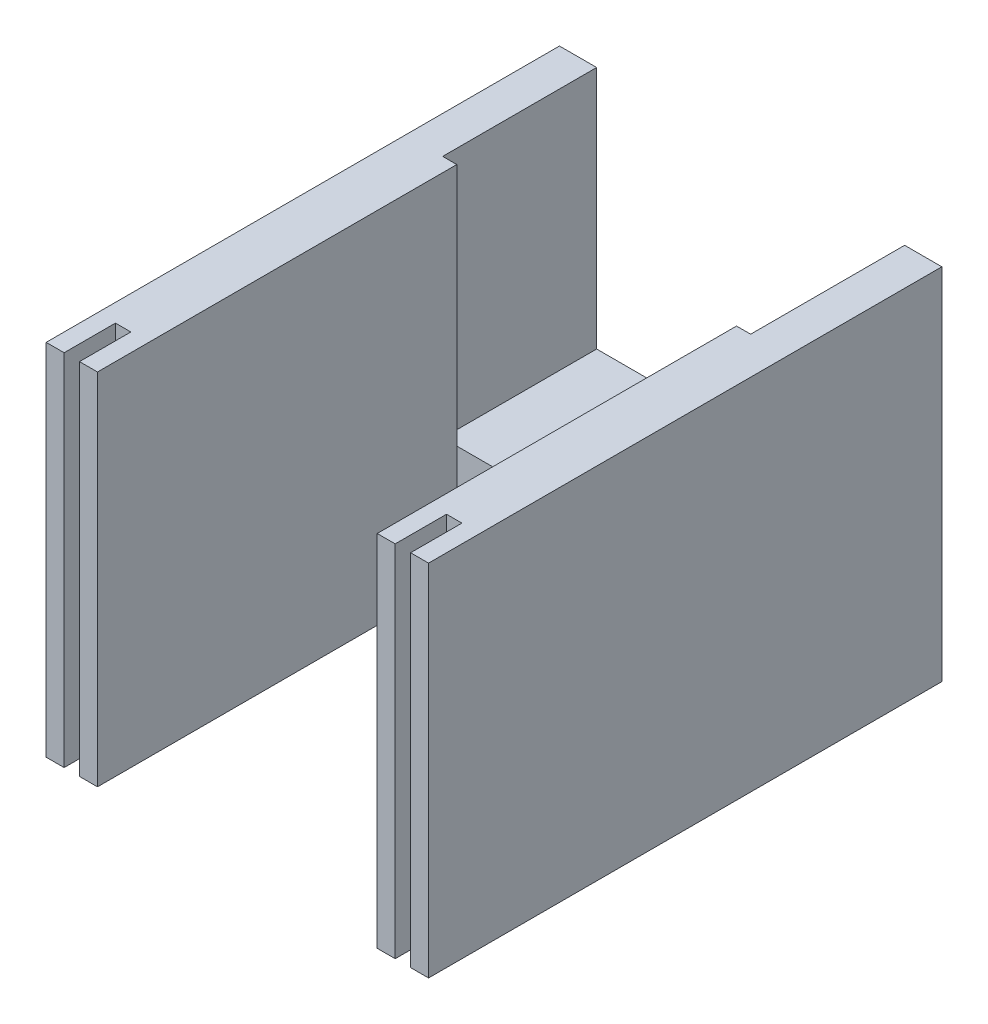
ISO-10303-21;
HEADER;
FILE_DESCRIPTION(('STEP AP214'),'2;1');
FILE_NAME('part.step','',(''),(''),'','','');
FILE_SCHEMA(('AUTOMOTIVE_DESIGN { 1 0 10303 214 1 1 1 1 }'));
ENDSEC;
DATA;
#1=APPLICATION_CONTEXT('core data for automotive mechanical design processes');
#2=APPLICATION_PROTOCOL_DEFINITION('international standard','automotive_design',2000,#1);
#3=PRODUCT_CONTEXT('',#1,'mechanical');
#4=PRODUCT('Part','Part','',(#3));
#5=PRODUCT_RELATED_PRODUCT_CATEGORY('part','',(#4));
#6=PRODUCT_DEFINITION_FORMATION('','',#4);
#7=PRODUCT_DEFINITION_CONTEXT('part definition',#1,'design');
#8=PRODUCT_DEFINITION('design','',#6,#7);
#9=PRODUCT_DEFINITION_SHAPE('','',#8);
#10=(LENGTH_UNIT() NAMED_UNIT(*) SI_UNIT(.MILLI.,.METRE.));
#11=(NAMED_UNIT(*) PLANE_ANGLE_UNIT() SI_UNIT($,.RADIAN.));
#12=(NAMED_UNIT(*) SI_UNIT($,.STERADIAN.) SOLID_ANGLE_UNIT());
#13=UNCERTAINTY_MEASURE_WITH_UNIT(LENGTH_MEASURE(1.E-05),#10,'distance_accuracy_value','');
#14=(GEOMETRIC_REPRESENTATION_CONTEXT(3) GLOBAL_UNCERTAINTY_ASSIGNED_CONTEXT((#13)) GLOBAL_UNIT_ASSIGNED_CONTEXT((#10,
#11,#12)) REPRESENTATION_CONTEXT('',''));
#15=CARTESIAN_POINT('',(0.,0.,0.));
#16=DIRECTION('',(0.,0.,1.));
#17=DIRECTION('',(1.,0.,0.));
#18=AXIS2_PLACEMENT_3D('',#15,#16,#17);
#19=CARTESIAN_POINT('',(0.,0.,0.));
#20=DIRECTION('',(0.,1.,0.));
#21=DIRECTION('',(0.,0.,1.));
#22=AXIS2_PLACEMENT_3D('',#19,#20,#21);
#23=PLANE('',#22);
#24=DIRECTION('',(0.,0.,-1.));
#25=VECTOR('',#24,1.);
#26=CARTESIAN_POINT('',(61.3659700427576,0.,0.));
#27=LINE('',#26,#25);
#28=CARTESIAN_POINT('',(61.3659700427576,0.,-70.));
#29=VERTEX_POINT('',#28);
#30=CARTESIAN_POINT('',(61.3659700427576,0.,-100.));
#31=VERTEX_POINT('',#30);
#32=EDGE_CURVE('E233',#29,#31,#27,.T.);
#33=ORIENTED_EDGE('',*,*,#32,.T.);
#34=DIRECTION('',(1.,0.,0.));
#35=VECTOR('',#34,1.);
#36=CARTESIAN_POINT('',(0.,0.,-100.));
#37=LINE('',#36,#35);
#38=CARTESIAN_POINT('',(74.5,0.,-100.));
#39=VERTEX_POINT('',#38);
#40=EDGE_CURVE('E227',#31,#39,#37,.T.);
#41=ORIENTED_EDGE('',*,*,#40,.T.);
#42=DIRECTION('',(0.,0.,-1.));
#43=VECTOR('',#42,1.);
#44=CARTESIAN_POINT('',(74.5,0.,0.));
#45=LINE('',#44,#43);
#46=CARTESIAN_POINT('',(74.5,0.,0.));
#47=VERTEX_POINT('',#46);
#48=EDGE_CURVE('E417',#47,#39,#45,.T.);
#49=ORIENTED_EDGE('',*,*,#48,.F.);
#50=DIRECTION('',(1.,0.,0.));
#51=VECTOR('',#50,1.);
#52=CARTESIAN_POINT('',(0.,0.,0.));
#53=LINE('',#52,#51);
#54=CARTESIAN_POINT('',(71.,0.,0.));
#55=VERTEX_POINT('',#54);
#56=EDGE_CURVE('E381',#55,#47,#53,.T.);
#57=ORIENTED_EDGE('',*,*,#56,.F.);
#58=DIRECTION('',(0.,0.,-1.));
#59=VECTOR('',#58,1.);
#60=CARTESIAN_POINT('',(71.,0.,0.));
#61=LINE('',#60,#59);
#62=CARTESIAN_POINT('',(71.,0.,-10.));
#63=VERTEX_POINT('',#62);
#64=EDGE_CURVE('E278',#55,#63,#61,.T.);
#65=ORIENTED_EDGE('',*,*,#64,.T.);
#66=DIRECTION('',(-1.,0.,0.));
#67=VECTOR('',#66,1.);
#68=CARTESIAN_POINT('',(0.,0.,-10.));
#69=LINE('',#68,#67);
#70=CARTESIAN_POINT('',(68.,0.,-10.));
#71=VERTEX_POINT('',#70);
#72=EDGE_CURVE('E283',#63,#71,#69,.T.);
#73=ORIENTED_EDGE('',*,*,#72,.T.);
#74=DIRECTION('',(0.,0.,-1.));
#75=VECTOR('',#74,1.);
#76=CARTESIAN_POINT('',(68.,0.,0.));
#77=LINE('',#76,#75);
#78=CARTESIAN_POINT('',(68.,0.,0.));
#79=VERTEX_POINT('',#78);
#80=EDGE_CURVE('E275',#79,#71,#77,.T.);
#81=ORIENTED_EDGE('',*,*,#80,.F.);
#82=CARTESIAN_POINT('',(64.5,0.,0.));
#83=VERTEX_POINT('',#82);
#84=EDGE_CURVE('E419',#83,#79,#53,.T.);
#85=ORIENTED_EDGE('',*,*,#84,.F.);
#86=DIRECTION('',(0.,0.,-1.));
#87=VECTOR('',#86,1.);
#88=CARTESIAN_POINT('',(64.5,0.,0.));
#89=LINE('',#88,#87);
#90=CARTESIAN_POINT('',(64.5,0.,-70.));
#91=VERTEX_POINT('',#90);
#92=EDGE_CURVE('E357',#83,#91,#89,.T.);
#93=ORIENTED_EDGE('',*,*,#92,.T.);
#94=DIRECTION('',(1.,0.,0.));
#95=VECTOR('',#94,1.);
#96=CARTESIAN_POINT('',(0.,0.,-70.));
#97=LINE('',#96,#95);
#98=EDGE_CURVE('E361',#29,#91,#97,.T.);
#99=ORIENTED_EDGE('',*,*,#98,.F.);
#100=EDGE_LOOP('',(#33,#41,#49,#57,#65,#73,#81,#85,#93,#99));
#101=FACE_BOUND('',#100,.T.);
#102=ADVANCED_FACE('F38',(#101),#23,.F.);
#103=CARTESIAN_POINT('',(0.,70.,-100.));
#104=DIRECTION('',(0.,0.,-1.));
#105=DIRECTION('',(-1.,0.,0.));
#106=AXIS2_PLACEMENT_3D('',#103,#104,#105);
#107=PLANE('',#106);
#108=ORIENTED_EDGE('',*,*,#40,.F.);
#109=DIRECTION('',(0.,1.,0.));
#110=VECTOR('',#109,1.);
#111=CARTESIAN_POINT('',(61.3659700427576,0.,-100.));
#112=LINE('',#111,#110);
#113=CARTESIAN_POINT('',(61.3659700427576,10.,-100.));
#114=VERTEX_POINT('',#113);
#115=EDGE_CURVE('E209',#31,#114,#112,.T.);
#116=ORIENTED_EDGE('',*,*,#115,.T.);
#117=DIRECTION('',(-1.,0.,0.));
#118=VECTOR('',#117,1.);
#119=CARTESIAN_POINT('',(61.3659700427576,10.,-100.));
#120=LINE('',#119,#118);
#121=CARTESIAN_POINT('',(10.6951974067737,10.,-100.));
#122=VERTEX_POINT('',#121);
#123=EDGE_CURVE('E217',#114,#122,#120,.T.);
#124=ORIENTED_EDGE('',*,*,#123,.T.);
#125=DIRECTION('',(0.,1.,0.));
#126=VECTOR('',#125,1.);
#127=CARTESIAN_POINT('',(10.6951974067737,0.,-100.));
#128=LINE('',#127,#126);
#129=CARTESIAN_POINT('',(10.6951974067737,0.,-100.));
#130=VERTEX_POINT('',#129);
#131=EDGE_CURVE('E222',#130,#122,#128,.T.);
#132=ORIENTED_EDGE('',*,*,#131,.F.);
#133=CARTESIAN_POINT('',(0.,0.,-100.));
#134=VERTEX_POINT('',#133);
#135=EDGE_CURVE('E423',#134,#130,#37,.T.);
#136=ORIENTED_EDGE('',*,*,#135,.F.);
#137=DIRECTION('',(0.,-1.,0.));
#138=VECTOR('',#137,1.);
#139=CARTESIAN_POINT('',(0.,70.,-100.));
#140=LINE('',#139,#138);
#141=CARTESIAN_POINT('',(0.,70.,-100.));
#142=VERTEX_POINT('',#141);
#143=EDGE_CURVE('E434',#142,#134,#140,.T.);
#144=ORIENTED_EDGE('',*,*,#143,.F.);
#145=DIRECTION('',(1.,0.,0.));
#146=VECTOR('',#145,1.);
#147=CARTESIAN_POINT('',(0.,70.,-100.));
#148=LINE('',#147,#146);
#149=CARTESIAN_POINT('',(7.25,70.,-100.));
#150=VERTEX_POINT('',#149);
#151=EDGE_CURVE('E404',#142,#150,#148,.T.);
#152=ORIENTED_EDGE('',*,*,#151,.T.);
#153=DIRECTION('',(0.,1.,0.));
#154=VECTOR('',#153,1.);
#155=CARTESIAN_POINT('',(7.25,22.5,-100.));
#156=LINE('',#155,#154);
#157=CARTESIAN_POINT('',(7.25,22.5,-100.));
#158=VERTEX_POINT('',#157);
#159=EDGE_CURVE('E328',#158,#150,#156,.T.);
#160=ORIENTED_EDGE('',*,*,#159,.F.);
#161=DIRECTION('',(-1.,0.,0.));
#162=VECTOR('',#161,1.);
#163=CARTESIAN_POINT('',(0.,22.5,-100.));
#164=LINE('',#163,#162);
#165=CARTESIAN_POINT('',(67.25,22.5,-100.));
#166=VERTEX_POINT('',#165);
#167=EDGE_CURVE('E311',#166,#158,#164,.T.);
#168=ORIENTED_EDGE('',*,*,#167,.F.);
#169=DIRECTION('',(0.,1.,0.));
#170=VECTOR('',#169,1.);
#171=CARTESIAN_POINT('',(67.25,22.5,-100.));
#172=LINE('',#171,#170);
#173=CARTESIAN_POINT('',(67.25,70.,-100.));
#174=VERTEX_POINT('',#173);
#175=EDGE_CURVE('E340',#166,#174,#172,.T.);
#176=ORIENTED_EDGE('',*,*,#175,.T.);
#177=CARTESIAN_POINT('',(74.5,70.,-100.));
#178=VERTEX_POINT('',#177);
#179=EDGE_CURVE('E403',#174,#178,#148,.T.);
#180=ORIENTED_EDGE('',*,*,#179,.T.);
#181=DIRECTION('',(0.,-1.,0.));
#182=VECTOR('',#181,1.);
#183=CARTESIAN_POINT('',(74.5,70.,-100.));
#184=LINE('',#183,#182);
#185=EDGE_CURVE('E437',#178,#39,#184,.T.);
#186=ORIENTED_EDGE('',*,*,#185,.T.);
#187=EDGE_LOOP('',(#108,#116,#124,#132,#136,#144,#152,#160,#168,#176,#180,#186));
#188=FACE_BOUND('',#187,.T.);
#189=ADVANCED_FACE('F225',(#188),#107,.T.);
#190=CARTESIAN_POINT('',(0.,0.,-70.));
#191=DIRECTION('',(0.,0.,1.));
#192=DIRECTION('',(1.,0.,0.));
#193=AXIS2_PLACEMENT_3D('',#190,#191,#192);
#194=PLANE('',#193);
#195=DIRECTION('',(1.,0.,0.));
#196=VECTOR('',#195,1.);
#197=CARTESIAN_POINT('',(0.,10.,-70.));
#198=LINE('',#197,#196);
#199=CARTESIAN_POINT('',(10.6951974067737,10.,-70.));
#200=VERTEX_POINT('',#199);
#201=CARTESIAN_POINT('',(61.3659700427576,10.,-70.));
#202=VERTEX_POINT('',#201);
#203=EDGE_CURVE('E47',#200,#202,#198,.T.);
#204=ORIENTED_EDGE('',*,*,#203,.T.);
#205=DIRECTION('',(0.,-1.,0.));
#206=VECTOR('',#205,1.);
#207=CARTESIAN_POINT('',(61.3659700427576,0.,-70.));
#208=LINE('',#207,#206);
#209=EDGE_CURVE('E11',#202,#29,#208,.T.);
#210=ORIENTED_EDGE('',*,*,#209,.T.);
#211=ORIENTED_EDGE('',*,*,#98,.T.);
#212=DIRECTION('',(0.,1.,0.));
#213=VECTOR('',#212,1.);
#214=CARTESIAN_POINT('',(64.5,0.,-70.));
#215=LINE('',#214,#213);
#216=CARTESIAN_POINT('',(64.5,22.5,-70.));
#217=VERTEX_POINT('',#216);
#218=EDGE_CURVE('E386',#91,#217,#215,.T.);
#219=ORIENTED_EDGE('',*,*,#218,.T.);
#220=DIRECTION('',(-1.,0.,0.));
#221=VECTOR('',#220,1.);
#222=CARTESIAN_POINT('',(0.,22.5,-70.));
#223=LINE('',#222,#221);
#224=CARTESIAN_POINT('',(10.,22.5,-70.));
#225=VERTEX_POINT('',#224);
#226=EDGE_CURVE('E325',#217,#225,#223,.T.);
#227=ORIENTED_EDGE('',*,*,#226,.T.);
#228=DIRECTION('',(0.,1.,0.));
#229=VECTOR('',#228,1.);
#230=CARTESIAN_POINT('',(10.,0.,-70.));
#231=LINE('',#230,#229);
#232=CARTESIAN_POINT('',(10.,0.,-70.));
#233=VERTEX_POINT('',#232);
#234=EDGE_CURVE('E382',#233,#225,#231,.T.);
#235=ORIENTED_EDGE('',*,*,#234,.F.);
#236=CARTESIAN_POINT('',(10.6951974067737,0.,-70.));
#237=VERTEX_POINT('',#236);
#238=EDGE_CURVE('E363',#233,#237,#97,.T.);
#239=ORIENTED_EDGE('',*,*,#238,.T.);
#240=DIRECTION('',(0.,-1.,0.));
#241=VECTOR('',#240,1.);
#242=CARTESIAN_POINT('',(10.6951974067737,0.,-70.));
#243=LINE('',#242,#241);
#244=EDGE_CURVE('E444',#200,#237,#243,.T.);
#245=ORIENTED_EDGE('',*,*,#244,.F.);
#246=EDGE_LOOP('',(#204,#210,#211,#219,#227,#235,#239,#245));
#247=FACE_BOUND('',#246,.T.);
#248=ADVANCED_FACE('F449',(#247),#194,.T.);
#249=ORIENTED_EDGE('',*,*,#135,.T.);
#250=DIRECTION('',(0.,0.,-1.));
#251=VECTOR('',#250,1.);
#252=CARTESIAN_POINT('',(10.6951974067737,0.,0.));
#253=LINE('',#252,#251);
#254=EDGE_CURVE('E236',#237,#130,#253,.T.);
#255=ORIENTED_EDGE('',*,*,#254,.F.);
#256=ORIENTED_EDGE('',*,*,#238,.F.);
#257=DIRECTION('',(0.,0.,-1.));
#258=VECTOR('',#257,1.);
#259=CARTESIAN_POINT('',(10.,0.,0.));
#260=LINE('',#259,#258);
#261=CARTESIAN_POINT('',(10.,0.,0.));
#262=VERTEX_POINT('',#261);
#263=EDGE_CURVE('E367',#262,#233,#260,.T.);
#264=ORIENTED_EDGE('',*,*,#263,.F.);
#265=CARTESIAN_POINT('',(6.5,0.,0.));
#266=VERTEX_POINT('',#265);
#267=EDGE_CURVE('E418',#266,#262,#53,.T.);
#268=ORIENTED_EDGE('',*,*,#267,.F.);
#269=DIRECTION('',(0.,0.,-1.));
#270=VECTOR('',#269,1.);
#271=CARTESIAN_POINT('',(6.5,0.,0.));
#272=LINE('',#271,#270);
#273=CARTESIAN_POINT('',(6.5,0.,-10.));
#274=VERTEX_POINT('',#273);
#275=EDGE_CURVE('E62',#266,#274,#272,.T.);
#276=ORIENTED_EDGE('',*,*,#275,.T.);
#277=DIRECTION('',(-1.,0.,0.));
#278=VECTOR('',#277,1.);
#279=CARTESIAN_POINT('',(0.,0.,-10.));
#280=LINE('',#279,#278);
#281=CARTESIAN_POINT('',(3.5,0.,-10.));
#282=VERTEX_POINT('',#281);
#283=EDGE_CURVE('E247',#274,#282,#280,.T.);
#284=ORIENTED_EDGE('',*,*,#283,.T.);
#285=DIRECTION('',(0.,0.,-1.));
#286=VECTOR('',#285,1.);
#287=CARTESIAN_POINT('',(3.5,0.,0.));
#288=LINE('',#287,#286);
#289=CARTESIAN_POINT('',(3.5,0.,0.));
#290=VERTEX_POINT('',#289);
#291=EDGE_CURVE('E241',#290,#282,#288,.T.);
#292=ORIENTED_EDGE('',*,*,#291,.F.);
#293=CARTESIAN_POINT('',(0.,0.,0.));
#294=VERTEX_POINT('',#293);
#295=EDGE_CURVE('E413',#294,#290,#53,.T.);
#296=ORIENTED_EDGE('',*,*,#295,.F.);
#297=DIRECTION('',(0.,0.,-1.));
#298=VECTOR('',#297,1.);
#299=CARTESIAN_POINT('',(0.,0.,0.));
#300=LINE('',#299,#298);
#301=EDGE_CURVE('E427',#294,#134,#300,.T.);
#302=ORIENTED_EDGE('',*,*,#301,.T.);
#303=EDGE_LOOP('',(#249,#255,#256,#264,#268,#276,#284,#292,#296,#302));
#304=FACE_BOUND('',#303,.T.);
#305=ADVANCED_FACE('F456',(#304),#23,.F.);
#306=CARTESIAN_POINT('',(0.,70.,0.));
#307=DIRECTION('',(0.,1.,0.));
#308=DIRECTION('',(0.,0.,1.));
#309=AXIS2_PLACEMENT_3D('',#306,#307,#308);
#310=PLANE('',#309);
#311=DIRECTION('',(1.,0.,0.));
#312=VECTOR('',#311,1.);
#313=CARTESIAN_POINT('',(0.,70.,0.));
#314=LINE('',#313,#312);
#315=CARTESIAN_POINT('',(0.,70.,0.));
#316=VERTEX_POINT('',#315);
#317=CARTESIAN_POINT('',(3.5,70.,0.));
#318=VERTEX_POINT('',#317);
#319=EDGE_CURVE('E393',#316,#318,#314,.T.);
#320=ORIENTED_EDGE('',*,*,#319,.T.);
#321=DIRECTION('',(0.,0.,-1.));
#322=VECTOR('',#321,1.);
#323=CARTESIAN_POINT('',(3.5,70.,0.));
#324=LINE('',#323,#322);
#325=CARTESIAN_POINT('',(3.5,70.,-10.));
#326=VERTEX_POINT('',#325);
#327=EDGE_CURVE('E214',#318,#326,#324,.T.);
#328=ORIENTED_EDGE('',*,*,#327,.T.);
#329=DIRECTION('',(-1.,0.,0.));
#330=VECTOR('',#329,1.);
#331=CARTESIAN_POINT('',(0.,70.,-10.));
#332=LINE('',#331,#330);
#333=CARTESIAN_POINT('',(6.5,70.,-10.));
#334=VERTEX_POINT('',#333);
#335=EDGE_CURVE('E244',#334,#326,#332,.T.);
#336=ORIENTED_EDGE('',*,*,#335,.F.);
#337=DIRECTION('',(0.,0.,-1.));
#338=VECTOR('',#337,1.);
#339=CARTESIAN_POINT('',(6.5,70.,0.));
#340=LINE('',#339,#338);
#341=CARTESIAN_POINT('',(6.5,70.,0.));
#342=VERTEX_POINT('',#341);
#343=EDGE_CURVE('E255',#342,#334,#340,.T.);
#344=ORIENTED_EDGE('',*,*,#343,.F.);
#345=CARTESIAN_POINT('',(10.,70.,0.));
#346=VERTEX_POINT('',#345);
#347=EDGE_CURVE('E398',#342,#346,#314,.T.);
#348=ORIENTED_EDGE('',*,*,#347,.T.);
#349=DIRECTION('',(0.,0.,-1.));
#350=VECTOR('',#349,1.);
#351=CARTESIAN_POINT('',(10.,70.,0.));
#352=LINE('',#351,#350);
#353=CARTESIAN_POINT('',(10.,70.,-70.));
#354=VERTEX_POINT('',#353);
#355=EDGE_CURVE('E362',#346,#354,#352,.T.);
#356=ORIENTED_EDGE('',*,*,#355,.T.);
#357=DIRECTION('',(-1.,0.,0.));
#358=VECTOR('',#357,1.);
#359=CARTESIAN_POINT('',(0.,70.,-70.));
#360=LINE('',#359,#358);
#361=CARTESIAN_POINT('',(7.25,70.,-70.));
#362=VERTEX_POINT('',#361);
#363=EDGE_CURVE('E332',#354,#362,#360,.T.);
#364=ORIENTED_EDGE('',*,*,#363,.T.);
#365=DIRECTION('',(0.,0.,1.));
#366=VECTOR('',#365,1.);
#367=CARTESIAN_POINT('',(7.25,70.,0.));
#368=LINE('',#367,#366);
#369=EDGE_CURVE('E301',#150,#362,#368,.T.);
#370=ORIENTED_EDGE('',*,*,#369,.F.);
#371=ORIENTED_EDGE('',*,*,#151,.F.);
#372=DIRECTION('',(0.,0.,-1.));
#373=VECTOR('',#372,1.);
#374=CARTESIAN_POINT('',(0.,70.,0.));
#375=LINE('',#374,#373);
#376=EDGE_CURVE('E408',#316,#142,#375,.T.);
#377=ORIENTED_EDGE('',*,*,#376,.F.);
#378=EDGE_LOOP('',(#320,#328,#336,#344,#348,#356,#364,#370,#371,#377));
#379=FACE_BOUND('',#378,.T.);
#380=ADVANCED_FACE('F467',(#379),#310,.T.);
#381=CARTESIAN_POINT('',(0.,70.,0.));
#382=DIRECTION('',(0.,0.,-1.));
#383=DIRECTION('',(-1.,0.,0.));
#384=AXIS2_PLACEMENT_3D('',#381,#382,#383);
#385=PLANE('',#384);
#386=DIRECTION('',(0.,1.,0.));
#387=VECTOR('',#386,1.);
#388=CARTESIAN_POINT('',(3.5,0.,0.));
#389=LINE('',#388,#387);
#390=EDGE_CURVE('E251',#290,#318,#389,.T.);
#391=ORIENTED_EDGE('',*,*,#390,.T.);
#392=ORIENTED_EDGE('',*,*,#319,.F.);
#393=DIRECTION('',(0.,-1.,0.));
#394=VECTOR('',#393,1.);
#395=CARTESIAN_POINT('',(0.,70.,0.));
#396=LINE('',#395,#394);
#397=EDGE_CURVE('E412',#316,#294,#396,.T.);
#398=ORIENTED_EDGE('',*,*,#397,.T.);
#399=ORIENTED_EDGE('',*,*,#295,.T.);
#400=EDGE_LOOP('',(#391,#392,#398,#399));
#401=FACE_BOUND('',#400,.T.);
#402=ADVANCED_FACE('F472',(#401),#385,.F.);
#403=CARTESIAN_POINT('',(64.5,70.,0.));
#404=VERTEX_POINT('',#403);
#405=CARTESIAN_POINT('',(68.,70.,0.));
#406=VERTEX_POINT('',#405);
#407=EDGE_CURVE('E399',#404,#406,#314,.T.);
#408=ORIENTED_EDGE('',*,*,#407,.T.);
#409=DIRECTION('',(0.,0.,-1.));
#410=VECTOR('',#409,1.);
#411=CARTESIAN_POINT('',(68.,70.,0.));
#412=LINE('',#411,#410);
#413=CARTESIAN_POINT('',(68.,70.,-10.));
#414=VERTEX_POINT('',#413);
#415=EDGE_CURVE('E265',#406,#414,#412,.T.);
#416=ORIENTED_EDGE('',*,*,#415,.T.);
#417=DIRECTION('',(-1.,0.,0.));
#418=VECTOR('',#417,1.);
#419=CARTESIAN_POINT('',(0.,70.,-10.));
#420=LINE('',#419,#418);
#421=CARTESIAN_POINT('',(71.,70.,-10.));
#422=VERTEX_POINT('',#421);
#423=EDGE_CURVE('E279',#422,#414,#420,.T.);
#424=ORIENTED_EDGE('',*,*,#423,.F.);
#425=DIRECTION('',(0.,0.,-1.));
#426=VECTOR('',#425,1.);
#427=CARTESIAN_POINT('',(71.,70.,0.));
#428=LINE('',#427,#426);
#429=CARTESIAN_POINT('',(71.,70.,0.));
#430=VERTEX_POINT('',#429);
#431=EDGE_CURVE('E291',#430,#422,#428,.T.);
#432=ORIENTED_EDGE('',*,*,#431,.F.);
#433=CARTESIAN_POINT('',(74.5,70.,0.));
#434=VERTEX_POINT('',#433);
#435=EDGE_CURVE('E431',#430,#434,#314,.T.);
#436=ORIENTED_EDGE('',*,*,#435,.T.);
#437=DIRECTION('',(0.,0.,-1.));
#438=VECTOR('',#437,1.);
#439=CARTESIAN_POINT('',(74.5,70.,0.));
#440=LINE('',#439,#438);
#441=EDGE_CURVE('E397',#434,#178,#440,.T.);
#442=ORIENTED_EDGE('',*,*,#441,.T.);
#443=ORIENTED_EDGE('',*,*,#179,.F.);
#444=DIRECTION('',(0.,0.,1.));
#445=VECTOR('',#444,1.);
#446=CARTESIAN_POINT('',(67.25,70.,0.));
#447=LINE('',#446,#445);
#448=CARTESIAN_POINT('',(67.25,70.,-70.));
#449=VERTEX_POINT('',#448);
#450=EDGE_CURVE('E316',#174,#449,#447,.T.);
#451=ORIENTED_EDGE('',*,*,#450,.T.);
#452=CARTESIAN_POINT('',(64.5,70.,-70.));
#453=VERTEX_POINT('',#452);
#454=EDGE_CURVE('E333',#449,#453,#360,.T.);
#455=ORIENTED_EDGE('',*,*,#454,.T.);
#456=DIRECTION('',(0.,0.,-1.));
#457=VECTOR('',#456,1.);
#458=CARTESIAN_POINT('',(64.5,70.,0.));
#459=LINE('',#458,#457);
#460=EDGE_CURVE('E356',#404,#453,#459,.T.);
#461=ORIENTED_EDGE('',*,*,#460,.F.);
#462=EDGE_LOOP('',(#408,#416,#424,#432,#436,#442,#443,#451,#455,#461));
#463=FACE_BOUND('',#462,.T.);
#464=ADVANCED_FACE('F497',(#463),#310,.T.);
#465=DIRECTION('',(0.,1.,0.));
#466=VECTOR('',#465,1.);
#467=CARTESIAN_POINT('',(68.,0.,0.));
#468=LINE('',#467,#466);
#469=EDGE_CURVE('E287',#79,#406,#468,.T.);
#470=ORIENTED_EDGE('',*,*,#469,.T.);
#471=ORIENTED_EDGE('',*,*,#407,.F.);
#472=DIRECTION('',(0.,1.,0.));
#473=VECTOR('',#472,1.);
#474=CARTESIAN_POINT('',(64.5,0.,0.));
#475=LINE('',#474,#473);
#476=EDGE_CURVE('E370',#83,#404,#475,.T.);
#477=ORIENTED_EDGE('',*,*,#476,.F.);
#478=ORIENTED_EDGE('',*,*,#84,.T.);
#479=EDGE_LOOP('',(#470,#471,#477,#478));
#480=FACE_BOUND('',#479,.T.);
#481=ADVANCED_FACE('F574',(#480),#385,.F.);
#482=ORIENTED_EDGE('',*,*,#347,.F.);
#483=DIRECTION('',(0.,1.,0.));
#484=VECTOR('',#483,1.);
#485=CARTESIAN_POINT('',(6.5,0.,0.));
#486=LINE('',#485,#484);
#487=EDGE_CURVE('E269',#266,#342,#486,.T.);
#488=ORIENTED_EDGE('',*,*,#487,.F.);
#489=ORIENTED_EDGE('',*,*,#267,.T.);
#490=DIRECTION('',(0.,1.,0.));
#491=VECTOR('',#490,1.);
#492=CARTESIAN_POINT('',(10.,0.,0.));
#493=LINE('',#492,#491);
#494=EDGE_CURVE('E377',#262,#346,#493,.T.);
#495=ORIENTED_EDGE('',*,*,#494,.T.);
#496=EDGE_LOOP('',(#482,#488,#489,#495));
#497=FACE_BOUND('',#496,.T.);
#498=ADVANCED_FACE('F486',(#497),#385,.F.);
#499=ORIENTED_EDGE('',*,*,#435,.F.);
#500=DIRECTION('',(0.,1.,0.));
#501=VECTOR('',#500,1.);
#502=CARTESIAN_POINT('',(71.,0.,0.));
#503=LINE('',#502,#501);
#504=EDGE_CURVE('E305',#55,#430,#503,.T.);
#505=ORIENTED_EDGE('',*,*,#504,.F.);
#506=ORIENTED_EDGE('',*,*,#56,.T.);
#507=DIRECTION('',(0.,-1.,0.));
#508=VECTOR('',#507,1.);
#509=CARTESIAN_POINT('',(74.5,70.,0.));
#510=LINE('',#509,#508);
#511=EDGE_CURVE('E440',#434,#47,#510,.T.);
#512=ORIENTED_EDGE('',*,*,#511,.F.);
#513=EDGE_LOOP('',(#499,#505,#506,#512));
#514=FACE_BOUND('',#513,.T.);
#515=ADVANCED_FACE('F40',(#514),#385,.F.);
#516=CARTESIAN_POINT('',(74.5,70.,0.));
#517=DIRECTION('',(-1.,0.,0.));
#518=DIRECTION('',(0.,0.,1.));
#519=AXIS2_PLACEMENT_3D('',#516,#517,#518);
#520=PLANE('',#519);
#521=ORIENTED_EDGE('',*,*,#48,.T.);
#522=ORIENTED_EDGE('',*,*,#185,.F.);
#523=ORIENTED_EDGE('',*,*,#441,.F.);
#524=ORIENTED_EDGE('',*,*,#511,.T.);
#525=EDGE_LOOP('',(#521,#522,#523,#524));
#526=FACE_BOUND('',#525,.T.);
#527=ADVANCED_FACE('F505',(#526),#520,.F.);
#528=CARTESIAN_POINT('',(0.,70.,0.));
#529=DIRECTION('',(-1.,0.,0.));
#530=DIRECTION('',(0.,0.,1.));
#531=AXIS2_PLACEMENT_3D('',#528,#529,#530);
#532=PLANE('',#531);
#533=ORIENTED_EDGE('',*,*,#301,.F.);
#534=ORIENTED_EDGE('',*,*,#397,.F.);
#535=ORIENTED_EDGE('',*,*,#376,.T.);
#536=ORIENTED_EDGE('',*,*,#143,.T.);
#537=EDGE_LOOP('',(#533,#534,#535,#536));
#538=FACE_BOUND('',#537,.T.);
#539=ADVANCED_FACE('F469',(#538),#532,.T.);
#540=CARTESIAN_POINT('',(10.,0.,0.));
#541=DIRECTION('',(1.,0.,0.));
#542=DIRECTION('',(0.,0.,-1.));
#543=AXIS2_PLACEMENT_3D('',#540,#541,#542);
#544=PLANE('',#543);
#545=ORIENTED_EDGE('',*,*,#355,.F.);
#546=ORIENTED_EDGE('',*,*,#494,.F.);
#547=ORIENTED_EDGE('',*,*,#263,.T.);
#548=ORIENTED_EDGE('',*,*,#234,.T.);
#549=DIRECTION('',(0.,1.,0.));
#550=VECTOR('',#549,1.);
#551=CARTESIAN_POINT('',(10.,0.,-70.));
#552=LINE('',#551,#550);
#553=EDGE_CURVE('E344',#225,#354,#552,.T.);
#554=ORIENTED_EDGE('',*,*,#553,.T.);
#555=EDGE_LOOP('',(#545,#546,#547,#548,#554));
#556=FACE_BOUND('',#555,.T.);
#557=ADVANCED_FACE('F537',(#556),#544,.T.);
#558=CARTESIAN_POINT('',(64.5,0.,0.));
#559=DIRECTION('',(1.,0.,0.));
#560=DIRECTION('',(0.,0.,-1.));
#561=AXIS2_PLACEMENT_3D('',#558,#559,#560);
#562=PLANE('',#561);
#563=ORIENTED_EDGE('',*,*,#460,.T.);
#564=EDGE_CURVE('E390',#217,#453,#215,.T.);
#565=ORIENTED_EDGE('',*,*,#564,.F.);
#566=ORIENTED_EDGE('',*,*,#218,.F.);
#567=ORIENTED_EDGE('',*,*,#92,.F.);
#568=ORIENTED_EDGE('',*,*,#476,.T.);
#569=EDGE_LOOP('',(#563,#565,#566,#567,#568));
#570=FACE_BOUND('',#569,.T.);
#571=ADVANCED_FACE('F571',(#570),#562,.F.);
#572=CARTESIAN_POINT('',(0.,22.5,-70.));
#573=DIRECTION('',(0.,0.,-1.));
#574=DIRECTION('',(-1.,0.,0.));
#575=AXIS2_PLACEMENT_3D('',#572,#573,#574);
#576=PLANE('',#575);
#577=ORIENTED_EDGE('',*,*,#564,.T.);
#578=ORIENTED_EDGE('',*,*,#454,.F.);
#579=DIRECTION('',(0.,1.,0.));
#580=VECTOR('',#579,1.);
#581=CARTESIAN_POINT('',(67.25,22.5,-70.));
#582=LINE('',#581,#580);
#583=CARTESIAN_POINT('',(67.25,22.5,-70.));
#584=VERTEX_POINT('',#583);
#585=EDGE_CURVE('E345',#584,#449,#582,.T.);
#586=ORIENTED_EDGE('',*,*,#585,.F.);
#587=EDGE_CURVE('E321',#584,#217,#223,.T.);
#588=ORIENTED_EDGE('',*,*,#587,.T.);
#589=EDGE_LOOP('',(#577,#578,#586,#588));
#590=FACE_BOUND('',#589,.T.);
#591=ADVANCED_FACE('F521',(#590),#576,.T.);
#592=CARTESIAN_POINT('',(67.25,22.5,0.));
#593=DIRECTION('',(-1.,0.,0.));
#594=DIRECTION('',(0.,0.,1.));
#595=AXIS2_PLACEMENT_3D('',#592,#593,#594);
#596=PLANE('',#595);
#597=ORIENTED_EDGE('',*,*,#450,.F.);
#598=ORIENTED_EDGE('',*,*,#175,.F.);
#599=DIRECTION('',(0.,0.,1.));
#600=VECTOR('',#599,1.);
#601=CARTESIAN_POINT('',(67.25,22.5,0.));
#602=LINE('',#601,#600);
#603=EDGE_CURVE('E324',#166,#584,#602,.T.);
#604=ORIENTED_EDGE('',*,*,#603,.T.);
#605=ORIENTED_EDGE('',*,*,#585,.T.);
#606=EDGE_LOOP('',(#597,#598,#604,#605));
#607=FACE_BOUND('',#606,.T.);
#608=ADVANCED_FACE('F516',(#607),#596,.T.);
#609=CARTESIAN_POINT('',(7.25,22.5,-70.));
#610=VERTEX_POINT('',#609);
#611=EDGE_CURVE('E320',#225,#610,#223,.T.);
#612=ORIENTED_EDGE('',*,*,#611,.T.);
#613=DIRECTION('',(0.,1.,0.));
#614=VECTOR('',#613,1.);
#615=CARTESIAN_POINT('',(7.25,22.5,-70.));
#616=LINE('',#615,#614);
#617=EDGE_CURVE('E348',#610,#362,#616,.T.);
#618=ORIENTED_EDGE('',*,*,#617,.T.);
#619=ORIENTED_EDGE('',*,*,#363,.F.);
#620=ORIENTED_EDGE('',*,*,#553,.F.);
#621=EDGE_LOOP('',(#612,#618,#619,#620));
#622=FACE_BOUND('',#621,.T.);
#623=ADVANCED_FACE('F533',(#622),#576,.T.);
#624=CARTESIAN_POINT('',(7.25,22.5,0.));
#625=DIRECTION('',(-1.,0.,0.));
#626=DIRECTION('',(0.,0.,1.));
#627=AXIS2_PLACEMENT_3D('',#624,#625,#626);
#628=PLANE('',#627);
#629=ORIENTED_EDGE('',*,*,#369,.T.);
#630=ORIENTED_EDGE('',*,*,#617,.F.);
#631=DIRECTION('',(0.,0.,1.));
#632=VECTOR('',#631,1.);
#633=CARTESIAN_POINT('',(7.25,22.5,0.));
#634=LINE('',#633,#632);
#635=EDGE_CURVE('E315',#158,#610,#634,.T.);
#636=ORIENTED_EDGE('',*,*,#635,.F.);
#637=ORIENTED_EDGE('',*,*,#159,.T.);
#638=EDGE_LOOP('',(#629,#630,#636,#637));
#639=FACE_BOUND('',#638,.T.);
#640=ADVANCED_FACE('F541',(#639),#628,.F.);
#641=CARTESIAN_POINT('',(0.,22.5,0.));
#642=DIRECTION('',(0.,1.,0.));
#643=DIRECTION('',(0.,0.,1.));
#644=AXIS2_PLACEMENT_3D('',#641,#642,#643);
#645=PLANE('',#644);
#646=ORIENTED_EDGE('',*,*,#167,.T.);
#647=ORIENTED_EDGE('',*,*,#635,.T.);
#648=ORIENTED_EDGE('',*,*,#611,.F.);
#649=ORIENTED_EDGE('',*,*,#226,.F.);
#650=ORIENTED_EDGE('',*,*,#587,.F.);
#651=ORIENTED_EDGE('',*,*,#603,.F.);
#652=EDGE_LOOP('',(#646,#647,#648,#649,#650,#651));
#653=FACE_BOUND('',#652,.T.);
#654=ADVANCED_FACE('F539',(#653),#645,.T.);
#655=CARTESIAN_POINT('',(68.,0.,0.));
#656=DIRECTION('',(1.,0.,0.));
#657=DIRECTION('',(0.,0.,-1.));
#658=AXIS2_PLACEMENT_3D('',#655,#656,#657);
#659=PLANE('',#658);
#660=ORIENTED_EDGE('',*,*,#415,.F.);
#661=ORIENTED_EDGE('',*,*,#469,.F.);
#662=ORIENTED_EDGE('',*,*,#80,.T.);
#663=DIRECTION('',(0.,1.,0.));
#664=VECTOR('',#663,1.);
#665=CARTESIAN_POINT('',(68.,0.,-10.));
#666=LINE('',#665,#664);
#667=EDGE_CURVE('E298',#71,#414,#666,.T.);
#668=ORIENTED_EDGE('',*,*,#667,.T.);
#669=EDGE_LOOP('',(#660,#661,#662,#668));
#670=FACE_BOUND('',#669,.T.);
#671=ADVANCED_FACE('F548',(#670),#659,.T.);
#672=CARTESIAN_POINT('',(0.,0.,-10.));
#673=DIRECTION('',(0.,0.,-1.));
#674=DIRECTION('',(-1.,0.,0.));
#675=AXIS2_PLACEMENT_3D('',#672,#673,#674);
#676=PLANE('',#675);
#677=ORIENTED_EDGE('',*,*,#423,.T.);
#678=ORIENTED_EDGE('',*,*,#667,.F.);
#679=ORIENTED_EDGE('',*,*,#72,.F.);
#680=DIRECTION('',(0.,1.,0.));
#681=VECTOR('',#680,1.);
#682=CARTESIAN_POINT('',(71.,0.,-10.));
#683=LINE('',#682,#681);
#684=EDGE_CURVE('E302',#63,#422,#683,.T.);
#685=ORIENTED_EDGE('',*,*,#684,.T.);
#686=EDGE_LOOP('',(#677,#678,#679,#685));
#687=FACE_BOUND('',#686,.T.);
#688=ADVANCED_FACE('F657',(#687),#676,.F.);
#689=CARTESIAN_POINT('',(71.,0.,0.));
#690=DIRECTION('',(1.,0.,0.));
#691=DIRECTION('',(0.,0.,-1.));
#692=AXIS2_PLACEMENT_3D('',#689,#690,#691);
#693=PLANE('',#692);
#694=ORIENTED_EDGE('',*,*,#431,.T.);
#695=ORIENTED_EDGE('',*,*,#684,.F.);
#696=ORIENTED_EDGE('',*,*,#64,.F.);
#697=ORIENTED_EDGE('',*,*,#504,.T.);
#698=EDGE_LOOP('',(#694,#695,#696,#697));
#699=FACE_BOUND('',#698,.T.);
#700=ADVANCED_FACE('F598',(#699),#693,.F.);
#701=CARTESIAN_POINT('',(3.5,0.,0.));
#702=DIRECTION('',(1.,0.,0.));
#703=DIRECTION('',(0.,0.,-1.));
#704=AXIS2_PLACEMENT_3D('',#701,#702,#703);
#705=PLANE('',#704);
#706=ORIENTED_EDGE('',*,*,#327,.F.);
#707=ORIENTED_EDGE('',*,*,#390,.F.);
#708=ORIENTED_EDGE('',*,*,#291,.T.);
#709=DIRECTION('',(0.,1.,0.));
#710=VECTOR('',#709,1.);
#711=CARTESIAN_POINT('',(3.5,0.,-10.));
#712=LINE('',#711,#710);
#713=EDGE_CURVE('E262',#282,#326,#712,.T.);
#714=ORIENTED_EDGE('',*,*,#713,.T.);
#715=EDGE_LOOP('',(#706,#707,#708,#714));
#716=FACE_BOUND('',#715,.T.);
#717=ADVANCED_FACE('F476',(#716),#705,.T.);
#718=CARTESIAN_POINT('',(0.,0.,-10.));
#719=DIRECTION('',(0.,0.,-1.));
#720=DIRECTION('',(-1.,0.,0.));
#721=AXIS2_PLACEMENT_3D('',#718,#719,#720);
#722=PLANE('',#721);
#723=ORIENTED_EDGE('',*,*,#335,.T.);
#724=ORIENTED_EDGE('',*,*,#713,.F.);
#725=ORIENTED_EDGE('',*,*,#283,.F.);
#726=DIRECTION('',(0.,1.,0.));
#727=VECTOR('',#726,1.);
#728=CARTESIAN_POINT('',(6.5,0.,-10.));
#729=LINE('',#728,#727);
#730=EDGE_CURVE('E266',#274,#334,#729,.T.);
#731=ORIENTED_EDGE('',*,*,#730,.T.);
#732=EDGE_LOOP('',(#723,#724,#725,#731));
#733=FACE_BOUND('',#732,.T.);
#734=ADVANCED_FACE('F481',(#733),#722,.F.);
#735=CARTESIAN_POINT('',(6.5,0.,0.));
#736=DIRECTION('',(1.,0.,0.));
#737=DIRECTION('',(0.,0.,-1.));
#738=AXIS2_PLACEMENT_3D('',#735,#736,#737);
#739=PLANE('',#738);
#740=ORIENTED_EDGE('',*,*,#343,.T.);
#741=ORIENTED_EDGE('',*,*,#730,.F.);
#742=ORIENTED_EDGE('',*,*,#275,.F.);
#743=ORIENTED_EDGE('',*,*,#487,.T.);
#744=EDGE_LOOP('',(#740,#741,#742,#743));
#745=FACE_BOUND('',#744,.T.);
#746=ADVANCED_FACE('F482',(#745),#739,.F.);
#747=CARTESIAN_POINT('',(61.3659700427576,0.,0.));
#748=DIRECTION('',(-1.,0.,0.));
#749=DIRECTION('',(0.,0.,1.));
#750=AXIS2_PLACEMENT_3D('',#747,#748,#749);
#751=PLANE('',#750);
#752=DIRECTION('',(0.,0.,-1.));
#753=VECTOR('',#752,1.);
#754=CARTESIAN_POINT('',(61.3659700427576,10.,0.));
#755=LINE('',#754,#753);
#756=EDGE_CURVE('E205',#202,#114,#755,.T.);
#757=ORIENTED_EDGE('',*,*,#756,.T.);
#758=ORIENTED_EDGE('',*,*,#115,.F.);
#759=ORIENTED_EDGE('',*,*,#32,.F.);
#760=ORIENTED_EDGE('',*,*,#209,.F.);
#761=EDGE_LOOP('',(#757,#758,#759,#760));
#762=FACE_BOUND('',#761,.T.);
#763=ADVANCED_FACE('F207',(#762),#751,.T.);
#764=CARTESIAN_POINT('',(61.3659700427576,10.,0.));
#765=DIRECTION('',(0.,-1.,0.));
#766=DIRECTION('',(0.,0.,-1.));
#767=AXIS2_PLACEMENT_3D('',#764,#765,#766);
#768=PLANE('',#767);
#769=DIRECTION('',(0.,0.,-1.));
#770=VECTOR('',#769,1.);
#771=CARTESIAN_POINT('',(10.6951974067737,10.,0.));
#772=LINE('',#771,#770);
#773=EDGE_CURVE('E54',#200,#122,#772,.T.);
#774=ORIENTED_EDGE('',*,*,#773,.T.);
#775=ORIENTED_EDGE('',*,*,#123,.F.);
#776=ORIENTED_EDGE('',*,*,#756,.F.);
#777=ORIENTED_EDGE('',*,*,#203,.F.);
#778=EDGE_LOOP('',(#774,#775,#776,#777));
#779=FACE_BOUND('',#778,.T.);
#780=ADVANCED_FACE('F218',(#779),#768,.T.);
#781=CARTESIAN_POINT('',(10.6951974067737,0.,0.));
#782=DIRECTION('',(-1.,0.,0.));
#783=DIRECTION('',(0.,0.,1.));
#784=AXIS2_PLACEMENT_3D('',#781,#782,#783);
#785=PLANE('',#784);
#786=ORIENTED_EDGE('',*,*,#244,.T.);
#787=ORIENTED_EDGE('',*,*,#254,.T.);
#788=ORIENTED_EDGE('',*,*,#131,.T.);
#789=ORIENTED_EDGE('',*,*,#773,.F.);
#790=EDGE_LOOP('',(#786,#787,#788,#789));
#791=FACE_BOUND('',#790,.T.);
#792=ADVANCED_FACE('F454',(#791),#785,.F.);
#793=CLOSED_SHELL('',(#102,#189,#248,#305,#380,#402,#464,#481,#498,#515,#527,#539,#557,#571,
#591,#608,#623,#640,#654,#671,#688,#700,#717,#734,#746,#763,#780,#792));
#794=MANIFOLD_SOLID_BREP('B2',#793);
#795=ADVANCED_BREP_SHAPE_REPRESENTATION('',(#18,#794),#14);
#796=SHAPE_DEFINITION_REPRESENTATION(#9,#795);
ENDSEC;
END-ISO-10303-21;
